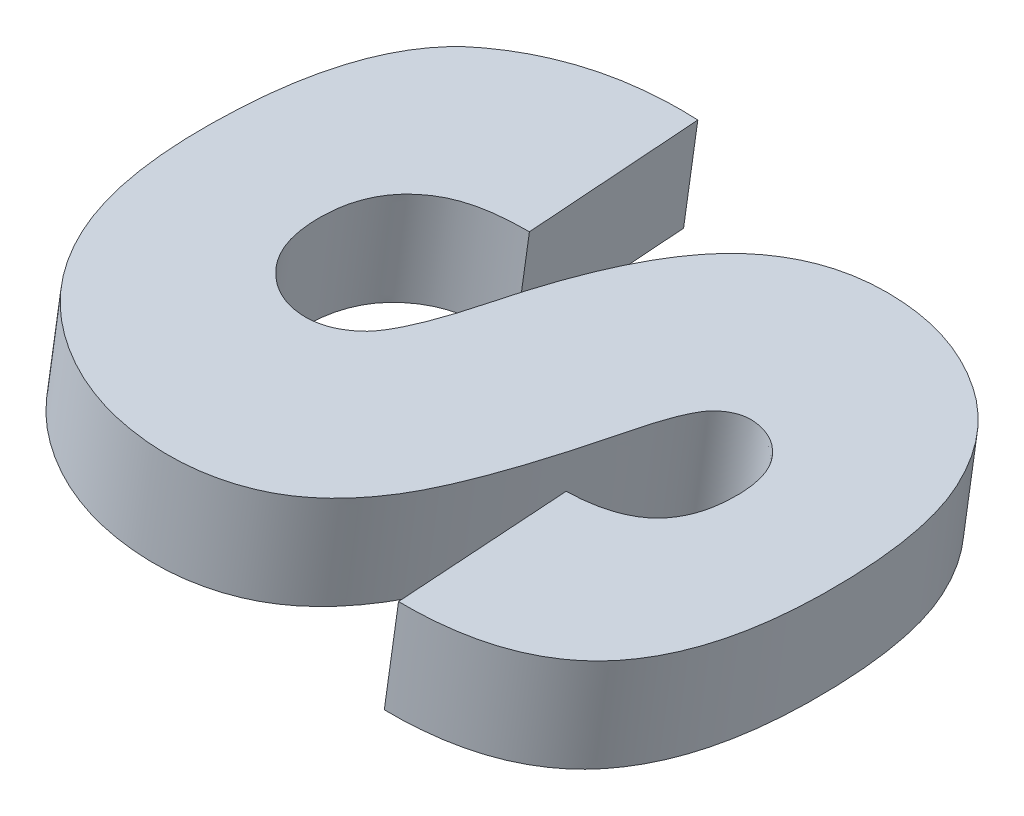
ISO-10303-21;
HEADER;
FILE_DESCRIPTION(('STEP AP214'),'2;1');
FILE_NAME('part.step','',(''),(''),'','','');
FILE_SCHEMA(('AUTOMOTIVE_DESIGN { 1 0 10303 214 1 1 1 1 }'));
ENDSEC;
DATA;
#1=APPLICATION_CONTEXT('core data for automotive mechanical design processes');
#2=APPLICATION_PROTOCOL_DEFINITION('international standard','automotive_design',2000,#1);
#3=PRODUCT_CONTEXT('',#1,'mechanical');
#4=PRODUCT('Part','Part','',(#3));
#5=PRODUCT_RELATED_PRODUCT_CATEGORY('part','',(#4));
#6=PRODUCT_DEFINITION_FORMATION('','',#4);
#7=PRODUCT_DEFINITION_CONTEXT('part definition',#1,'design');
#8=PRODUCT_DEFINITION('design','',#6,#7);
#9=PRODUCT_DEFINITION_SHAPE('','',#8);
#10=(LENGTH_UNIT() NAMED_UNIT(*) SI_UNIT(.MILLI.,.METRE.));
#11=(NAMED_UNIT(*) PLANE_ANGLE_UNIT() SI_UNIT($,.RADIAN.));
#12=(NAMED_UNIT(*) SI_UNIT($,.STERADIAN.) SOLID_ANGLE_UNIT());
#13=UNCERTAINTY_MEASURE_WITH_UNIT(LENGTH_MEASURE(1.E-05),#10,'distance_accuracy_value','');
#14=(GEOMETRIC_REPRESENTATION_CONTEXT(3) GLOBAL_UNCERTAINTY_ASSIGNED_CONTEXT((#13)) GLOBAL_UNIT_ASSIGNED_CONTEXT((#10,
#11,#12)) REPRESENTATION_CONTEXT('',''));
#15=CARTESIAN_POINT('',(0.,0.,0.));
#16=DIRECTION('',(0.,0.,1.));
#17=DIRECTION('',(1.,0.,0.));
#18=AXIS2_PLACEMENT_3D('',#15,#16,#17);
#19=CARTESIAN_POINT('',(700.391108231908,637.548190039406,2017.41529355107));
#20=DIRECTION('',(0.988324038200684,-0.138947979463736,-0.0625224321155088));
#21=DIRECTION('',(-0.06201979299293,0.00794858788436329,-0.998043268214239));
#22=AXIS2_PLACEMENT_3D('',#19,#20,#21);
#23=PLANE('',#22);
#24=CARTESIAN_POINT('',(698.999377626086,627.645512225029,2017.42291099554));
#25=CARTESIAN_POINT('',(699.547459413983,627.575268903523,2026.24282658125));
#26=CARTESIAN_POINT('',(700.095541201879,627.505025582018,2035.06274216697));
#27=B_SPLINE_CURVE_WITH_KNOTS('',2,(#24,#25,#26),.UNSPECIFIED.,.F.,.F.,(3,3),(0.,1.),.UNSPECIFIED.);
#28=CARTESIAN_POINT('',(698.999377626086,627.645512225029,2017.42291099554));
#29=VERTEX_POINT('',#28);
#30=CARTESIAN_POINT('',(700.095541201879,627.505025582018,2035.06274216697));
#31=VERTEX_POINT('',#30);
#32=EDGE_CURVE('E91',#29,#31,#27,.T.);
#33=ORIENTED_EDGE('',*,*,#32,.F.);
#34=DIRECTION('',(-0.139173060582166,-0.990267781437723,0.000761744447259827));
#35=VECTOR('',#34,1.);
#36=CARTESIAN_POINT('',(700.391108231908,637.548190039406,2017.41529355107));
#37=LINE('',#36,#35);
#38=CARTESIAN_POINT('',(700.391108231908,637.548190039406,2017.41529355107));
#39=VERTEX_POINT('',#38);
#40=EDGE_CURVE('E33',#39,#29,#37,.T.);
#41=ORIENTED_EDGE('',*,*,#40,.F.);
#42=CARTESIAN_POINT('',(700.391108231908,637.548190039406,2017.41529355107));
#43=CARTESIAN_POINT('',(700.939190019804,637.477946717901,2026.23520913678));
#44=CARTESIAN_POINT('',(701.487271807701,637.407703396395,2035.05512472249));
#45=B_SPLINE_CURVE_WITH_KNOTS('',2,(#42,#43,#44),.UNSPECIFIED.,.F.,.F.,(3,3),(0.,1.),.UNSPECIFIED.);
#46=CARTESIAN_POINT('',(701.487271807701,637.407703396395,2035.05512472249));
#47=VERTEX_POINT('',#46);
#48=EDGE_CURVE('E72',#39,#47,#45,.T.);
#49=ORIENTED_EDGE('',*,*,#48,.T.);
#50=DIRECTION('',(-0.139173060582166,-0.990267781437723,0.000761744447259827));
#51=VECTOR('',#50,1.);
#52=CARTESIAN_POINT('',(701.487271807701,637.407703396395,2035.05512472249));
#53=LINE('',#52,#51);
#54=EDGE_CURVE('E11',#47,#31,#53,.T.);
#55=ORIENTED_EDGE('',*,*,#54,.T.);
#56=EDGE_LOOP('',(#33,#41,#49,#55));
#57=FACE_BOUND('',#56,.T.);
#58=ADVANCED_FACE('F17',(#57),#23,.T.);
#59=CARTESIAN_POINT('',(701.487271807701,637.407703396395,2035.05512472249));
#60=CARTESIAN_POINT('',(697.231746718322,638.006219204211,2035.62811227794));
#61=CARTESIAN_POINT('',(695.005961216943,638.320389830357,2037.39204836582));
#62=CARTESIAN_POINT('',(691.396005015237,638.829936774368,2040.25294040409));
#63=CARTESIAN_POINT('',(691.396569075147,638.83395026917,2045.5735391333));
#64=CARTESIAN_POINT('',(691.396989950618,638.836944953754,2049.54352433893));
#65=CARTESIAN_POINT('',(693.241304938903,638.579396234564,2051.69222767188));
#66=CARTESIAN_POINT('',(695.085619927187,638.321847515374,2053.84093100482));
#67=CARTESIAN_POINT('',(697.517383261069,637.980085466631,2053.84093100482));
#68=CARTESIAN_POINT('',(699.827558428256,637.655411520326,2053.84093100482));
#69=CARTESIAN_POINT('',(701.651163982547,637.397546331922,2051.7945468782));
#70=CARTESIAN_POINT('',(703.474769536839,637.139681143518,2049.74816275159));
#71=CARTESIAN_POINT('',(705.117196237818,636.903127064958,2042.30428596448));
#72=CARTESIAN_POINT('',(707.809331466184,636.515386432195,2030.10287513608));
#73=CARTESIAN_POINT('',(712.297505837075,635.880609553198,2024.89623652757));
#74=CARTESIAN_POINT('',(716.805749376336,635.242994227427,2019.66631609034));
#75=CARTESIAN_POINT('',(723.776804266795,634.263276354366,2019.66631609034));
#76=CARTESIAN_POINT('',(728.356625212271,633.619624495901,2019.66631609034));
#77=CARTESIAN_POINT('',(732.430112995938,633.049195248177,2022.34707929621));
#78=CARTESIAN_POINT('',(736.503600779605,632.478766000454,2025.02784250207));
#79=CARTESIAN_POINT('',(738.834611209534,632.155303841434,2030.40983275508));
#80=CARTESIAN_POINT('',(741.165621639463,631.831841682414,2035.79182300807));
#81=CARTESIAN_POINT('',(741.166615252689,631.838911607874,2045.16426230797));
#82=CARTESIAN_POINT('',(741.167834489878,631.847586931255,2056.66494109955));
#83=CARTESIAN_POINT('',(736.933153341086,632.44737627243,2062.70177427307));
#84=CARTESIAN_POINT('',(732.698472192295,633.047165613606,2068.73860744658));
#85=CARTESIAN_POINT('',(723.457893013373,634.346725843861,2069.88458255748));
#86=B_SPLINE_CURVE_WITH_KNOTS('',2,(#59,#60,#61,#62,#63,#64,#65,#66,#67,#68,#69,#70,#71,#72,#73,
#74,#75,#76,#77,#78,#79,#80,#81,#82,#83,#84,#85),.UNSPECIFIED.,.F.,.F.,(3,2,2,2,2,2,2,2,2,2,2,2,
2,3),(1.,2.,3.,4.,5.,6.,7.,8.,9.,10.,11.,12.,13.,14.),.UNSPECIFIED.);
#87=DIRECTION('',(-0.139173060582166,-0.990267781437723,0.000761744447259827));
#88=VECTOR('',#87,1.);
#89=SURFACE_OF_LINEAR_EXTRUSION('',#86,#88);
#90=CARTESIAN_POINT('',(700.095541201879,627.505025582018,2035.06274216697));
#91=CARTESIAN_POINT('',(695.840016112501,628.103541389834,2035.63572972241));
#92=CARTESIAN_POINT('',(693.614230611121,628.41771201598,2037.39966581029));
#93=CARTESIAN_POINT('',(690.004274409415,628.927258959991,2040.26055784856));
#94=CARTESIAN_POINT('',(690.004838469325,628.931272454793,2045.58115657776));
#95=CARTESIAN_POINT('',(690.005259344796,628.934267139377,2049.5511417834));
#96=CARTESIAN_POINT('',(691.849574333081,628.676718420187,2051.69984511634));
#97=CARTESIAN_POINT('',(693.693889321366,628.419169700997,2053.84854844929));
#98=CARTESIAN_POINT('',(696.125652655247,628.077407652254,2053.84854844929));
#99=CARTESIAN_POINT('',(698.435827822434,627.752733705949,2053.84854844929));
#100=CARTESIAN_POINT('',(700.259433376726,627.494868517545,2051.80216432268));
#101=CARTESIAN_POINT('',(702.083038931017,627.237003329141,2049.75578019606));
#102=CARTESIAN_POINT('',(703.725465631997,627.000449250581,2042.31190340896));
#103=CARTESIAN_POINT('',(706.417600860362,626.612708617817,2030.11049258056));
#104=CARTESIAN_POINT('',(710.905775231254,625.97793173882,2024.90385397203));
#105=CARTESIAN_POINT('',(715.414018770514,625.34031641305,2019.67393353481));
#106=CARTESIAN_POINT('',(722.385073660973,624.360598539989,2019.67393353481));
#107=CARTESIAN_POINT('',(726.964894606449,623.716946681524,2019.67393353481));
#108=CARTESIAN_POINT('',(731.038382390116,623.1465174338,2022.35469674068));
#109=CARTESIAN_POINT('',(735.111870173783,622.576088186076,2025.03545994655));
#110=CARTESIAN_POINT('',(737.442880603712,622.252626027056,2030.41745019954));
#111=CARTESIAN_POINT('',(739.773891033641,621.929163868036,2035.79944045255));
#112=CARTESIAN_POINT('',(739.774884646867,621.936233793497,2045.17187975245));
#113=CARTESIAN_POINT('',(739.776103884056,621.944909116878,2056.67255854402));
#114=CARTESIAN_POINT('',(735.541422735265,622.544698458053,2062.70939171753));
#115=CARTESIAN_POINT('',(731.306741586473,623.144487799229,2068.74622489105));
#116=CARTESIAN_POINT('',(722.066162407552,624.444048029484,2069.89220000195));
#117=B_SPLINE_CURVE_WITH_KNOTS('',2,(#90,#91,#92,#93,#94,#95,#96,#97,#98,#99,#100,#101,#102,
#103,#104,#105,#106,#107,#108,#109,#110,#111,#112,#113,#114,#115,#116),.UNSPECIFIED.,.F.,.F.,(3,
2,2,2,2,2,2,2,2,2,2,2,2,3),(1.,2.,3.,4.,5.,6.,7.,8.,9.,10.,11.,12.,13.,14.),.UNSPECIFIED.);
#118=CARTESIAN_POINT('',(722.066162407552,624.444048029484,2069.89220000195));
#119=VERTEX_POINT('',#118);
#120=EDGE_CURVE('E115',#31,#119,#117,.T.);
#121=ORIENTED_EDGE('',*,*,#120,.F.);
#122=ORIENTED_EDGE('',*,*,#54,.F.);
#123=CARTESIAN_POINT('',(723.457893013373,634.346725843861,2069.88458255748));
#124=VERTEX_POINT('',#123);
#125=EDGE_CURVE('E68',#47,#124,#86,.T.);
#126=ORIENTED_EDGE('',*,*,#125,.T.);
#127=DIRECTION('',(-0.139173060582166,-0.990267781437723,0.000761744447259827));
#128=VECTOR('',#127,1.);
#129=CARTESIAN_POINT('',(723.457893013373,634.346725843861,2069.88458255748));
#130=LINE('',#129,#128);
#131=EDGE_CURVE('E25',#124,#119,#130,.T.);
#132=ORIENTED_EDGE('',*,*,#131,.T.);
#133=EDGE_LOOP('',(#121,#122,#126,#132));
#134=FACE_BOUND('',#133,.T.);
#135=ADVANCED_FACE('F69',(#134),#89,.T.);
#136=CARTESIAN_POINT('',(723.457893013373,634.346725843861,2069.88458255748));
#137=DIRECTION('',(-0.988568968667015,0.138979267942132,0.058447902194197));
#138=DIRECTION('',(0.0579849411211757,-0.00738133651035802,0.998290169477039));
#139=AXIS2_PLACEMENT_3D('',#136,#137,#138);
#140=PLANE('',#139);
#141=CARTESIAN_POINT('',(722.066162407552,624.444048029484,2069.89220000195));
#142=CARTESIAN_POINT('',(721.558618686398,624.508657062918,2061.15413978131));
#143=CARTESIAN_POINT('',(721.051074965244,624.573266096352,2052.41607956066));
#144=B_SPLINE_CURVE_WITH_KNOTS('',2,(#141,#142,#143),.UNSPECIFIED.,.F.,.F.,(3,3),(14.,15.),.UNSPECIFIED.);
#145=CARTESIAN_POINT('',(721.051074965244,624.573266096352,2052.41607956066));
#146=VERTEX_POINT('',#145);
#147=EDGE_CURVE('E66',#119,#146,#144,.T.);
#148=ORIENTED_EDGE('',*,*,#147,.F.);
#149=ORIENTED_EDGE('',*,*,#131,.F.);
#150=CARTESIAN_POINT('',(723.457893013373,634.346725843861,2069.88458255748));
#151=CARTESIAN_POINT('',(722.95034929222,634.411334877295,2061.14652233684));
#152=CARTESIAN_POINT('',(722.442805571066,634.475943910729,2052.40846211619));
#153=B_SPLINE_CURVE_WITH_KNOTS('',2,(#150,#151,#152),.UNSPECIFIED.,.F.,.F.,(3,3),(14.,15.),.UNSPECIFIED.);
#154=CARTESIAN_POINT('',(722.442805571066,634.475943910729,2052.40846211619));
#155=VERTEX_POINT('',#154);
#156=EDGE_CURVE('E63',#124,#155,#153,.T.);
#157=ORIENTED_EDGE('',*,*,#156,.T.);
#158=DIRECTION('',(-0.139173060582166,-0.990267781437723,0.000761744447259827));
#159=VECTOR('',#158,1.);
#160=CARTESIAN_POINT('',(722.442805571066,634.475943910729,2052.40846211619));
#161=LINE('',#160,#159);
#162=EDGE_CURVE('E49',#155,#146,#161,.T.);
#163=ORIENTED_EDGE('',*,*,#162,.T.);
#164=EDGE_LOOP('',(#148,#149,#157,#163));
#165=FACE_BOUND('',#164,.T.);
#166=ADVANCED_FACE('F61',(#165),#140,.T.);
#167=CARTESIAN_POINT('',(722.442805571066,634.475943910729,2052.40846211619));
#168=CARTESIAN_POINT('',(726.455141310289,633.911511688676,2051.71269151314));
#169=CARTESIAN_POINT('',(728.27872733943,633.653507571606,2049.48213281513));
#170=CARTESIAN_POINT('',(730.102313368571,633.395503454536,2047.25157411712));
#171=CARTESIAN_POINT('',(730.101896832023,633.392539642989,2043.32251659402));
#172=CARTESIAN_POINT('',(730.101554057155,633.390100673071,2040.08922967396));
#173=CARTESIAN_POINT('',(728.743645972175,633.579682895474,2038.45212237267));
#174=CARTESIAN_POINT('',(727.385737887197,633.769265117877,2036.81501507138));
#175=CARTESIAN_POINT('',(725.440327220092,634.042674756871,2036.81501507138));
#176=CARTESIAN_POINT('',(724.021798608661,634.242035951971,2036.81501507138));
#177=CARTESIAN_POINT('',(722.865615811446,634.405551134625,2038.14658851572));
#178=CARTESIAN_POINT('',(721.711905471429,634.568716645678,2039.47531443598));
#179=CARTESIAN_POINT('',(720.675486502222,634.718149842695,2044.3815274143));
#180=CARTESIAN_POINT('',(718.106599190139,635.088537741051,2056.54215805195));
#181=CARTESIAN_POINT('',(715.452481768845,635.465595162842,2061.80136525735));
#182=CARTESIAN_POINT('',(712.798364347551,635.842652584633,2067.06057246276));
#183=CARTESIAN_POINT('',(708.867267451402,636.396973969428,2069.4548418909));
#184=CARTESIAN_POINT('',(704.936170555254,636.951295354223,2071.84911131904));
#185=CARTESIAN_POINT('',(700.072643887492,637.634819451707,2071.84911131904));
#186=CARTESIAN_POINT('',(694.358000052871,638.437960266252,2071.84911131904));
#187=CARTESIAN_POINT('',(689.534664338061,639.113380232709,2068.65675208151));
#188=CARTESIAN_POINT('',(684.711328623251,639.788800199167,2065.464392844));
#189=CARTESIAN_POINT('',(682.21816375689,640.134784073955,2059.73451728947));
#190=CARTESIAN_POINT('',(679.724998890528,640.480767948744,2054.00464173495));
#191=CARTESIAN_POINT('',(679.724074700061,640.474191991875,2045.28704535557));
#192=CARTESIAN_POINT('',(679.72245194309,640.462645476058,2029.98009208849));
#193=CARTESIAN_POINT('',(685.558059139582,639.637970841757,2024.08650580384));
#194=CARTESIAN_POINT('',(691.393666336073,638.813296207455,2018.19291951918));
#195=CARTESIAN_POINT('',(700.391108231908,637.548190039406,2017.41529355107));
#196=B_SPLINE_CURVE_WITH_KNOTS('',2,(#167,#168,#169,#170,#171,#172,#173,#174,#175,#176,#177,
#178,#179,#180,#181,#182,#183,#184,#185,#186,#187,#188,#189,#190,#191,#192,#193,#194,#195),
.UNSPECIFIED.,.F.,.F.,(3,2,2,2,2,2,2,2,2,2,2,2,2,2,3),(15.,16.,17.,18.,19.,20.,21.,22.,23.,24.,
25.,26.,27.,28.,29.),.UNSPECIFIED.);
#197=DIRECTION('',(-0.139173060582166,-0.990267781437723,0.000761744447259827));
#198=VECTOR('',#197,1.);
#199=SURFACE_OF_LINEAR_EXTRUSION('',#196,#198);
#200=CARTESIAN_POINT('',(721.051074965244,624.573266096352,2052.41607956066));
#201=CARTESIAN_POINT('',(725.063410704468,624.008833874299,2051.72030895761));
#202=CARTESIAN_POINT('',(726.886996733609,623.750829757229,2049.4897502596));
#203=CARTESIAN_POINT('',(728.71058276275,623.492825640158,2047.25919156159));
#204=CARTESIAN_POINT('',(728.710166226201,623.489861828612,2043.33013403849));
#205=CARTESIAN_POINT('',(728.709823451333,623.487422858693,2040.09684711844));
#206=CARTESIAN_POINT('',(727.351915366354,623.677005081097,2038.45973981714));
#207=CARTESIAN_POINT('',(725.994007281375,623.8665873035,2036.82263251585));
#208=CARTESIAN_POINT('',(724.04859661427,624.139996942494,2036.82263251585));
#209=CARTESIAN_POINT('',(722.63006800284,624.339358137594,2036.82263251585));
#210=CARTESIAN_POINT('',(721.473885205625,624.502873320248,2038.15420596019));
#211=CARTESIAN_POINT('',(720.320174865607,624.6660388313,2039.48293188045));
#212=CARTESIAN_POINT('',(719.2837558964,624.815472028317,2044.38914485877));
#213=CARTESIAN_POINT('',(716.714868584317,625.185859926674,2056.54977549643));
#214=CARTESIAN_POINT('',(714.060751163023,625.562917348465,2061.80898270182));
#215=CARTESIAN_POINT('',(711.406633741729,625.939974770256,2067.06818990723));
#216=CARTESIAN_POINT('',(707.475536845581,626.494296155051,2069.46245933537));
#217=CARTESIAN_POINT('',(703.544439949432,627.048617539845,2071.85672876351));
#218=CARTESIAN_POINT('',(698.68091328167,627.73214163733,2071.85672876351));
#219=CARTESIAN_POINT('',(692.966269447049,628.535282451875,2071.85672876351));
#220=CARTESIAN_POINT('',(688.14293373224,629.210702418332,2068.66436952598));
#221=CARTESIAN_POINT('',(683.31959801743,629.886122384789,2065.47201028846));
#222=CARTESIAN_POINT('',(680.826433151068,630.232106259578,2059.74213473395));
#223=CARTESIAN_POINT('',(678.333268284707,630.578090134367,2054.01225917942));
#224=CARTESIAN_POINT('',(678.332344094239,630.571514177498,2045.29466280004));
#225=CARTESIAN_POINT('',(678.330721337268,630.559967661681,2029.98770953296));
#226=CARTESIAN_POINT('',(684.16632853376,629.735293027379,2024.0941232483));
#227=CARTESIAN_POINT('',(690.001935730252,628.910618393078,2018.20053696366));
#228=CARTESIAN_POINT('',(698.999377626086,627.645512225029,2017.42291099554));
#229=B_SPLINE_CURVE_WITH_KNOTS('',2,(#200,#201,#202,#203,#204,#205,#206,#207,#208,#209,#210,
#211,#212,#213,#214,#215,#216,#217,#218,#219,#220,#221,#222,#223,#224,#225,#226,#227,#228),
.UNSPECIFIED.,.F.,.F.,(3,2,2,2,2,2,2,2,2,2,2,2,2,2,3),(15.,16.,17.,18.,19.,20.,21.,22.,23.,24.,
25.,26.,27.,28.,29.),.UNSPECIFIED.);
#230=EDGE_CURVE('E116',#146,#29,#229,.T.);
#231=ORIENTED_EDGE('',*,*,#230,.F.);
#232=ORIENTED_EDGE('',*,*,#162,.F.);
#233=EDGE_CURVE('E75',#155,#39,#196,.T.);
#234=ORIENTED_EDGE('',*,*,#233,.T.);
#235=ORIENTED_EDGE('',*,*,#40,.T.);
#236=EDGE_LOOP('',(#231,#232,#234,#235));
#237=FACE_BOUND('',#236,.T.);
#238=ADVANCED_FACE('F99',(#237),#199,.T.);
#239=CARTESIAN_POINT('',(708.258341251815,636.453627370636,2031.85156819105));
#240=DIRECTION('',(-0.139173060582125,-0.990267781437729,0.000761744447375312));
#241=DIRECTION('',(-0.00010601433688035,-0.000754331202776962,-0.999999709872656));
#242=AXIS2_PLACEMENT_3D('',#239,#240,#241);
#243=PLANE('',#242);
#244=ORIENTED_EDGE('',*,*,#48,.F.);
#245=ORIENTED_EDGE('',*,*,#233,.F.);
#246=ORIENTED_EDGE('',*,*,#156,.F.);
#247=ORIENTED_EDGE('',*,*,#125,.F.);
#248=EDGE_LOOP('',(#244,#245,#246,#247));
#249=FACE_BOUND('',#248,.T.);
#250=ADVANCED_FACE('F74',(#249),#243,.F.);
#251=CARTESIAN_POINT('',(706.866610645994,626.550949556259,2031.85918563553));
#252=DIRECTION('',(-0.139173060582125,-0.990267781437729,0.000761744447375312));
#253=DIRECTION('',(-0.00010601433688035,-0.000754331202776962,-0.999999709872656));
#254=AXIS2_PLACEMENT_3D('',#251,#252,#253);
#255=PLANE('',#254);
#256=ORIENTED_EDGE('',*,*,#32,.T.);
#257=ORIENTED_EDGE('',*,*,#120,.T.);
#258=ORIENTED_EDGE('',*,*,#147,.T.);
#259=ORIENTED_EDGE('',*,*,#230,.T.);
#260=EDGE_LOOP('',(#256,#257,#258,#259));
#261=FACE_BOUND('',#260,.T.);
#262=ADVANCED_FACE('F103',(#261),#255,.T.);
#263=CLOSED_SHELL('',(#58,#135,#166,#238,#250,#262));
#264=MANIFOLD_SOLID_BREP('B1',#263);
#265=ADVANCED_BREP_SHAPE_REPRESENTATION('',(#18,#264),#14);
#266=SHAPE_DEFINITION_REPRESENTATION(#9,#265);
ENDSEC;
END-ISO-10303-21;
